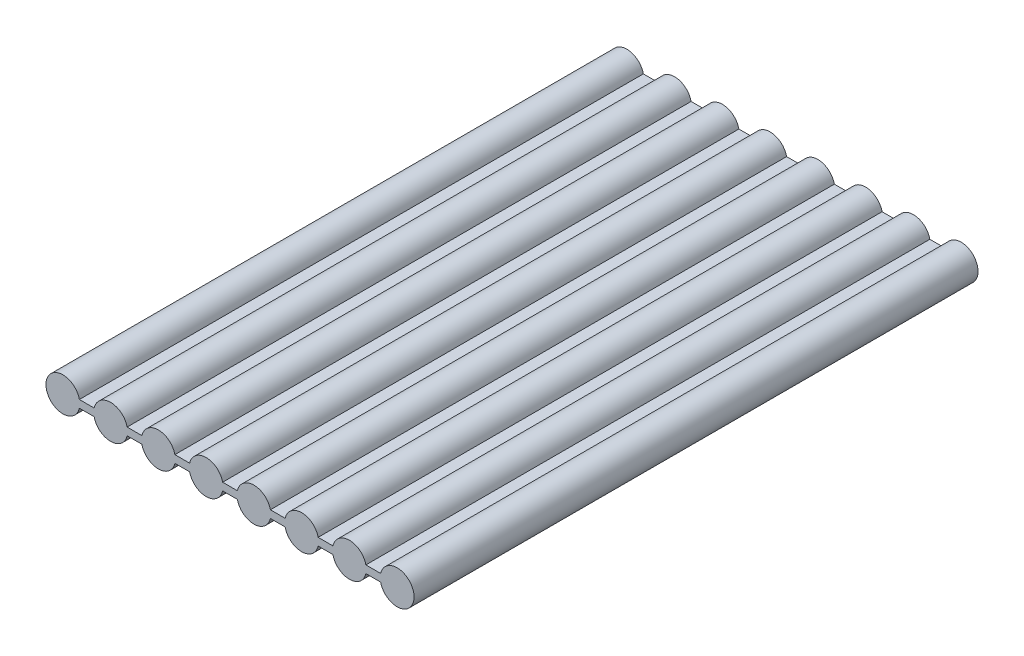
ISO-10303-21;
HEADER;
FILE_DESCRIPTION(('STEP AP214'),'2;1');
FILE_NAME('part.step','',(''),(''),'','','');
FILE_SCHEMA(('AUTOMOTIVE_DESIGN { 1 0 10303 214 1 1 1 1 }'));
ENDSEC;
DATA;
#1=APPLICATION_CONTEXT('core data for automotive mechanical design processes');
#2=APPLICATION_PROTOCOL_DEFINITION('international standard','automotive_design',2000,#1);
#3=PRODUCT_CONTEXT('',#1,'mechanical');
#4=PRODUCT('Part','Part','',(#3));
#5=PRODUCT_RELATED_PRODUCT_CATEGORY('part','',(#4));
#6=PRODUCT_DEFINITION_FORMATION('','',#4);
#7=PRODUCT_DEFINITION_CONTEXT('part definition',#1,'design');
#8=PRODUCT_DEFINITION('design','',#6,#7);
#9=PRODUCT_DEFINITION_SHAPE('','',#8);
#10=(LENGTH_UNIT() NAMED_UNIT(*) SI_UNIT(.MILLI.,.METRE.));
#11=(NAMED_UNIT(*) PLANE_ANGLE_UNIT() SI_UNIT($,.RADIAN.));
#12=(NAMED_UNIT(*) SI_UNIT($,.STERADIAN.) SOLID_ANGLE_UNIT());
#13=UNCERTAINTY_MEASURE_WITH_UNIT(LENGTH_MEASURE(1.E-05),#10,'distance_accuracy_value','');
#14=(GEOMETRIC_REPRESENTATION_CONTEXT(3) GLOBAL_UNCERTAINTY_ASSIGNED_CONTEXT((#13)) GLOBAL_UNIT_ASSIGNED_CONTEXT((#10,
#11,#12)) REPRESENTATION_CONTEXT('',''));
#15=CARTESIAN_POINT('',(0.,0.,0.));
#16=DIRECTION('',(0.,0.,1.));
#17=DIRECTION('',(1.,0.,0.));
#18=AXIS2_PLACEMENT_3D('',#15,#16,#17);
#19=CARTESIAN_POINT('',(3.175,0.,7.5));
#20=DIRECTION('',(0.,0.,-1.));
#21=DIRECTION('',(-1.,0.,0.));
#22=AXIS2_PLACEMENT_3D('',#19,#20,#21);
#23=CYLINDRICAL_SURFACE('',#22,0.45);
#24=DIRECTION('',(0.,0.,-1.));
#25=VECTOR('',#24,1.);
#26=CARTESIAN_POINT('',(3.61374821936961,-0.1,7.5));
#27=LINE('',#26,#25);
#28=CARTESIAN_POINT('',(3.61374821936961,-0.1,7.5));
#29=VERTEX_POINT('',#28);
#30=CARTESIAN_POINT('',(3.61374821936961,-0.1,-7.5));
#31=VERTEX_POINT('',#30);
#32=EDGE_CURVE('E231',#29,#31,#27,.T.);
#33=ORIENTED_EDGE('',*,*,#32,.F.);
#34=CARTESIAN_POINT('',(3.175,0.,7.5));
#35=DIRECTION('',(0.,0.,1.));
#36=DIRECTION('',(1.,0.,0.));
#37=AXIS2_PLACEMENT_3D('',#34,#35,#36);
#38=CIRCLE('',#37,0.45);
#39=CARTESIAN_POINT('',(2.73625178063039,-0.1,7.5));
#40=VERTEX_POINT('',#39);
#41=EDGE_CURVE('E256',#40,#29,#38,.T.);
#42=ORIENTED_EDGE('',*,*,#41,.F.);
#43=DIRECTION('',(0.,0.,-1.));
#44=VECTOR('',#43,1.);
#45=CARTESIAN_POINT('',(2.73625178063039,-0.0999999999999999,7.5));
#46=LINE('',#45,#44);
#47=CARTESIAN_POINT('',(2.73625178063039,-0.1,-7.5));
#48=VERTEX_POINT('',#47);
#49=EDGE_CURVE('E278',#40,#48,#46,.T.);
#50=ORIENTED_EDGE('',*,*,#49,.T.);
#51=CARTESIAN_POINT('',(3.175,0.,-7.5));
#52=DIRECTION('',(0.,0.,1.));
#53=DIRECTION('',(1.,0.,0.));
#54=AXIS2_PLACEMENT_3D('',#51,#52,#53);
#55=CIRCLE('',#54,0.45);
#56=EDGE_CURVE('E50',#48,#31,#55,.T.);
#57=ORIENTED_EDGE('',*,*,#56,.T.);
#58=EDGE_LOOP('',(#33,#42,#50,#57));
#59=FACE_BOUND('',#58,.T.);
#60=ADVANCED_FACE('F34',(#59),#23,.T.);
#61=DIRECTION('',(0.,0.,-1.));
#62=VECTOR('',#61,1.);
#63=CARTESIAN_POINT('',(3.61374821936961,0.1,7.5));
#64=LINE('',#63,#62);
#65=CARTESIAN_POINT('',(3.61374821936961,0.1,7.5));
#66=VERTEX_POINT('',#65);
#67=CARTESIAN_POINT('',(3.61374821936961,0.1,-7.5));
#68=VERTEX_POINT('',#67);
#69=EDGE_CURVE('E251',#66,#68,#64,.T.);
#70=ORIENTED_EDGE('',*,*,#69,.T.);
#71=CARTESIAN_POINT('',(2.73625178063039,0.1,-7.5));
#72=VERTEX_POINT('',#71);
#73=EDGE_CURVE('E255',#68,#72,#55,.T.);
#74=ORIENTED_EDGE('',*,*,#73,.T.);
#75=DIRECTION('',(0.,0.,-1.));
#76=VECTOR('',#75,1.);
#77=CARTESIAN_POINT('',(2.73625178063039,0.1,7.5));
#78=LINE('',#77,#76);
#79=CARTESIAN_POINT('',(2.73625178063039,0.1,7.5));
#80=VERTEX_POINT('',#79);
#81=EDGE_CURVE('E275',#80,#72,#78,.T.);
#82=ORIENTED_EDGE('',*,*,#81,.F.);
#83=EDGE_CURVE('E58',#66,#80,#38,.T.);
#84=ORIENTED_EDGE('',*,*,#83,.F.);
#85=EDGE_LOOP('',(#70,#74,#82,#84));
#86=FACE_BOUND('',#85,.T.);
#87=ADVANCED_FACE('F499',(#86),#23,.T.);
#88=CARTESIAN_POINT('',(1.905,0.,7.5));
#89=DIRECTION('',(0.,0.,-1.));
#90=DIRECTION('',(-1.,0.,0.));
#91=AXIS2_PLACEMENT_3D('',#88,#89,#90);
#92=CYLINDRICAL_SURFACE('',#91,0.45);
#93=DIRECTION('',(0.,0.,-1.));
#94=VECTOR('',#93,1.);
#95=CARTESIAN_POINT('',(2.34374821936961,-0.1,7.5));
#96=LINE('',#95,#94);
#97=CARTESIAN_POINT('',(2.34374821936961,-0.1,7.5));
#98=VERTEX_POINT('',#97);
#99=CARTESIAN_POINT('',(2.34374821936961,-0.1,-7.5));
#100=VERTEX_POINT('',#99);
#101=EDGE_CURVE('E280',#98,#100,#96,.T.);
#102=ORIENTED_EDGE('',*,*,#101,.F.);
#103=CARTESIAN_POINT('',(1.905,0.,7.5));
#104=DIRECTION('',(0.,0.,1.));
#105=DIRECTION('',(1.,0.,0.));
#106=AXIS2_PLACEMENT_3D('',#103,#104,#105);
#107=CIRCLE('',#106,0.45);
#108=CARTESIAN_POINT('',(1.46625178063039,-0.1,7.5));
#109=VERTEX_POINT('',#108);
#110=EDGE_CURVE('E284',#109,#98,#107,.T.);
#111=ORIENTED_EDGE('',*,*,#110,.F.);
#112=DIRECTION('',(0.,0.,-1.));
#113=VECTOR('',#112,1.);
#114=CARTESIAN_POINT('',(1.46625178063039,-0.0999999999999999,7.5));
#115=LINE('',#114,#113);
#116=CARTESIAN_POINT('',(1.46625178063039,-0.1,-7.5));
#117=VERTEX_POINT('',#116);
#118=EDGE_CURVE('E308',#109,#117,#115,.T.);
#119=ORIENTED_EDGE('',*,*,#118,.T.);
#120=CARTESIAN_POINT('',(1.905,0.,-7.5));
#121=DIRECTION('',(0.,0.,1.));
#122=DIRECTION('',(1.,0.,0.));
#123=AXIS2_PLACEMENT_3D('',#120,#121,#122);
#124=CIRCLE('',#123,0.45);
#125=EDGE_CURVE('E289',#117,#100,#124,.T.);
#126=ORIENTED_EDGE('',*,*,#125,.T.);
#127=EDGE_LOOP('',(#102,#111,#119,#126));
#128=FACE_BOUND('',#127,.T.);
#129=ADVANCED_FACE('F496',(#128),#92,.T.);
#130=DIRECTION('',(0.,0.,-1.));
#131=VECTOR('',#130,1.);
#132=CARTESIAN_POINT('',(2.34374821936961,0.1,7.5));
#133=LINE('',#132,#131);
#134=CARTESIAN_POINT('',(2.34374821936961,0.1,7.5));
#135=VERTEX_POINT('',#134);
#136=CARTESIAN_POINT('',(2.34374821936961,0.1,-7.5));
#137=VERTEX_POINT('',#136);
#138=EDGE_CURVE('E268',#135,#137,#133,.T.);
#139=ORIENTED_EDGE('',*,*,#138,.T.);
#140=CARTESIAN_POINT('',(1.46625178063039,0.1,-7.5));
#141=VERTEX_POINT('',#140);
#142=EDGE_CURVE('E283',#137,#141,#124,.T.);
#143=ORIENTED_EDGE('',*,*,#142,.T.);
#144=DIRECTION('',(0.,0.,-1.));
#145=VECTOR('',#144,1.);
#146=CARTESIAN_POINT('',(1.46625178063039,0.1,7.5));
#147=LINE('',#146,#145);
#148=CARTESIAN_POINT('',(1.46625178063039,0.1,7.5));
#149=VERTEX_POINT('',#148);
#150=EDGE_CURVE('E305',#149,#141,#147,.T.);
#151=ORIENTED_EDGE('',*,*,#150,.F.);
#152=EDGE_CURVE('E288',#135,#149,#107,.T.);
#153=ORIENTED_EDGE('',*,*,#152,.F.);
#154=EDGE_LOOP('',(#139,#143,#151,#153));
#155=FACE_BOUND('',#154,.T.);
#156=ADVANCED_FACE('F498',(#155),#92,.T.);
#157=CARTESIAN_POINT('',(0.635,0.,7.5));
#158=DIRECTION('',(0.,0.,-1.));
#159=DIRECTION('',(-1.,0.,0.));
#160=AXIS2_PLACEMENT_3D('',#157,#158,#159);
#161=CYLINDRICAL_SURFACE('',#160,0.45);
#162=DIRECTION('',(0.,0.,-1.));
#163=VECTOR('',#162,1.);
#164=CARTESIAN_POINT('',(1.07374821936961,-0.1,7.5));
#165=LINE('',#164,#163);
#166=CARTESIAN_POINT('',(1.07374821936961,-0.1,7.5));
#167=VERTEX_POINT('',#166);
#168=CARTESIAN_POINT('',(1.07374821936961,-0.1,-7.5));
#169=VERTEX_POINT('',#168);
#170=EDGE_CURVE('E310',#167,#169,#165,.T.);
#171=ORIENTED_EDGE('',*,*,#170,.F.);
#172=CARTESIAN_POINT('',(0.635,0.,7.5));
#173=DIRECTION('',(0.,0.,1.));
#174=DIRECTION('',(1.,0.,0.));
#175=AXIS2_PLACEMENT_3D('',#172,#173,#174);
#176=CIRCLE('',#175,0.45);
#177=CARTESIAN_POINT('',(0.196251780630394,-0.1,7.5));
#178=VERTEX_POINT('',#177);
#179=EDGE_CURVE('E314',#178,#167,#176,.T.);
#180=ORIENTED_EDGE('',*,*,#179,.F.);
#181=DIRECTION('',(0.,0.,-1.));
#182=VECTOR('',#181,1.);
#183=CARTESIAN_POINT('',(0.196251780630394,-0.0999999999999999,7.5));
#184=LINE('',#183,#182);
#185=CARTESIAN_POINT('',(0.196251780630394,-0.1,-7.5));
#186=VERTEX_POINT('',#185);
#187=EDGE_CURVE('E338',#178,#186,#184,.T.);
#188=ORIENTED_EDGE('',*,*,#187,.T.);
#189=CARTESIAN_POINT('',(0.635,0.,-7.5));
#190=DIRECTION('',(0.,0.,1.));
#191=DIRECTION('',(1.,0.,0.));
#192=AXIS2_PLACEMENT_3D('',#189,#190,#191);
#193=CIRCLE('',#192,0.45);
#194=EDGE_CURVE('E319',#186,#169,#193,.T.);
#195=ORIENTED_EDGE('',*,*,#194,.T.);
#196=EDGE_LOOP('',(#171,#180,#188,#195));
#197=FACE_BOUND('',#196,.T.);
#198=ADVANCED_FACE('F485',(#197),#161,.T.);
#199=DIRECTION('',(0.,0.,-1.));
#200=VECTOR('',#199,1.);
#201=CARTESIAN_POINT('',(1.07374821936961,0.1,7.5));
#202=LINE('',#201,#200);
#203=CARTESIAN_POINT('',(1.07374821936961,0.1,7.5));
#204=VERTEX_POINT('',#203);
#205=CARTESIAN_POINT('',(1.07374821936961,0.1,-7.5));
#206=VERTEX_POINT('',#205);
#207=EDGE_CURVE('E298',#204,#206,#202,.T.);
#208=ORIENTED_EDGE('',*,*,#207,.T.);
#209=CARTESIAN_POINT('',(0.196251780630394,0.1,-7.5));
#210=VERTEX_POINT('',#209);
#211=EDGE_CURVE('E313',#206,#210,#193,.T.);
#212=ORIENTED_EDGE('',*,*,#211,.T.);
#213=DIRECTION('',(0.,0.,-1.));
#214=VECTOR('',#213,1.);
#215=CARTESIAN_POINT('',(0.196251780630394,0.1,7.5));
#216=LINE('',#215,#214);
#217=CARTESIAN_POINT('',(0.196251780630394,0.1,7.5));
#218=VERTEX_POINT('',#217);
#219=EDGE_CURVE('E335',#218,#210,#216,.T.);
#220=ORIENTED_EDGE('',*,*,#219,.F.);
#221=EDGE_CURVE('E318',#204,#218,#176,.T.);
#222=ORIENTED_EDGE('',*,*,#221,.F.);
#223=EDGE_LOOP('',(#208,#212,#220,#222));
#224=FACE_BOUND('',#223,.T.);
#225=ADVANCED_FACE('F532',(#224),#161,.T.);
#226=CARTESIAN_POINT('',(-0.635,0.,7.5));
#227=DIRECTION('',(0.,0.,-1.));
#228=DIRECTION('',(-1.,0.,0.));
#229=AXIS2_PLACEMENT_3D('',#226,#227,#228);
#230=CYLINDRICAL_SURFACE('',#229,0.45);
#231=DIRECTION('',(0.,0.,-1.));
#232=VECTOR('',#231,1.);
#233=CARTESIAN_POINT('',(-0.196251780630394,-0.1,7.5));
#234=LINE('',#233,#232);
#235=CARTESIAN_POINT('',(-0.196251780630394,-0.1,7.5));
#236=VERTEX_POINT('',#235);
#237=CARTESIAN_POINT('',(-0.196251780630394,-0.1,-7.5));
#238=VERTEX_POINT('',#237);
#239=EDGE_CURVE('E340',#236,#238,#234,.T.);
#240=ORIENTED_EDGE('',*,*,#239,.F.);
#241=CARTESIAN_POINT('',(-0.635,0.,7.5));
#242=DIRECTION('',(0.,0.,1.));
#243=DIRECTION('',(1.,0.,0.));
#244=AXIS2_PLACEMENT_3D('',#241,#242,#243);
#245=CIRCLE('',#244,0.45);
#246=CARTESIAN_POINT('',(-1.07374821936961,-0.1,7.5));
#247=VERTEX_POINT('',#246);
#248=EDGE_CURVE('E344',#247,#236,#245,.T.);
#249=ORIENTED_EDGE('',*,*,#248,.F.);
#250=DIRECTION('',(0.,0.,-1.));
#251=VECTOR('',#250,1.);
#252=CARTESIAN_POINT('',(-1.07374821936961,-0.0999999999999999,7.5));
#253=LINE('',#252,#251);
#254=CARTESIAN_POINT('',(-1.07374821936961,-0.1,-7.5));
#255=VERTEX_POINT('',#254);
#256=EDGE_CURVE('E368',#247,#255,#253,.T.);
#257=ORIENTED_EDGE('',*,*,#256,.T.);
#258=CARTESIAN_POINT('',(-0.635,0.,-7.5));
#259=DIRECTION('',(0.,0.,1.));
#260=DIRECTION('',(1.,0.,0.));
#261=AXIS2_PLACEMENT_3D('',#258,#259,#260);
#262=CIRCLE('',#261,0.45);
#263=EDGE_CURVE('E349',#255,#238,#262,.T.);
#264=ORIENTED_EDGE('',*,*,#263,.T.);
#265=EDGE_LOOP('',(#240,#249,#257,#264));
#266=FACE_BOUND('',#265,.T.);
#267=ADVANCED_FACE('F475',(#266),#230,.T.);
#268=DIRECTION('',(0.,0.,-1.));
#269=VECTOR('',#268,1.);
#270=CARTESIAN_POINT('',(-0.196251780630394,0.1,7.5));
#271=LINE('',#270,#269);
#272=CARTESIAN_POINT('',(-0.196251780630394,0.1,7.5));
#273=VERTEX_POINT('',#272);
#274=CARTESIAN_POINT('',(-0.196251780630394,0.1,-7.5));
#275=VERTEX_POINT('',#274);
#276=EDGE_CURVE('E328',#273,#275,#271,.T.);
#277=ORIENTED_EDGE('',*,*,#276,.T.);
#278=CARTESIAN_POINT('',(-1.07374821936961,0.1,-7.5));
#279=VERTEX_POINT('',#278);
#280=EDGE_CURVE('E343',#275,#279,#262,.T.);
#281=ORIENTED_EDGE('',*,*,#280,.T.);
#282=DIRECTION('',(0.,0.,-1.));
#283=VECTOR('',#282,1.);
#284=CARTESIAN_POINT('',(-1.07374821936961,0.1,7.5));
#285=LINE('',#284,#283);
#286=CARTESIAN_POINT('',(-1.07374821936961,0.1,7.5));
#287=VERTEX_POINT('',#286);
#288=EDGE_CURVE('E365',#287,#279,#285,.T.);
#289=ORIENTED_EDGE('',*,*,#288,.F.);
#290=EDGE_CURVE('E348',#273,#287,#245,.T.);
#291=ORIENTED_EDGE('',*,*,#290,.F.);
#292=EDGE_LOOP('',(#277,#281,#289,#291));
#293=FACE_BOUND('',#292,.T.);
#294=ADVANCED_FACE('F541',(#293),#230,.T.);
#295=CARTESIAN_POINT('',(-1.905,0.,7.5));
#296=DIRECTION('',(0.,0.,-1.));
#297=DIRECTION('',(-1.,0.,0.));
#298=AXIS2_PLACEMENT_3D('',#295,#296,#297);
#299=CYLINDRICAL_SURFACE('',#298,0.45);
#300=DIRECTION('',(0.,0.,-1.));
#301=VECTOR('',#300,1.);
#302=CARTESIAN_POINT('',(-1.46625178063039,-0.1,7.5));
#303=LINE('',#302,#301);
#304=CARTESIAN_POINT('',(-1.46625178063039,-0.1,7.5));
#305=VERTEX_POINT('',#304);
#306=CARTESIAN_POINT('',(-1.46625178063039,-0.1,-7.5));
#307=VERTEX_POINT('',#306);
#308=EDGE_CURVE('E370',#305,#307,#303,.T.);
#309=ORIENTED_EDGE('',*,*,#308,.F.);
#310=CARTESIAN_POINT('',(-1.905,0.,7.5));
#311=DIRECTION('',(0.,0.,1.));
#312=DIRECTION('',(1.,0.,0.));
#313=AXIS2_PLACEMENT_3D('',#310,#311,#312);
#314=CIRCLE('',#313,0.45);
#315=CARTESIAN_POINT('',(-2.34374821936961,-0.1,7.5));
#316=VERTEX_POINT('',#315);
#317=EDGE_CURVE('E11',#316,#305,#314,.T.);
#318=ORIENTED_EDGE('',*,*,#317,.F.);
#319=DIRECTION('',(0.,0.,-1.));
#320=VECTOR('',#319,1.);
#321=CARTESIAN_POINT('',(-2.34374821936961,-0.0999999999999999,7.5));
#322=LINE('',#321,#320);
#323=CARTESIAN_POINT('',(-2.34374821936961,-0.0999999999999999,-7.5));
#324=VERTEX_POINT('',#323);
#325=EDGE_CURVE('E425',#316,#324,#322,.T.);
#326=ORIENTED_EDGE('',*,*,#325,.T.);
#327=CARTESIAN_POINT('',(-1.905,0.,-7.5));
#328=DIRECTION('',(0.,0.,1.));
#329=DIRECTION('',(1.,0.,0.));
#330=AXIS2_PLACEMENT_3D('',#327,#328,#329);
#331=CIRCLE('',#330,0.45);
#332=EDGE_CURVE('E38',#324,#307,#331,.T.);
#333=ORIENTED_EDGE('',*,*,#332,.T.);
#334=EDGE_LOOP('',(#309,#318,#326,#333));
#335=FACE_BOUND('',#334,.T.);
#336=ADVANCED_FACE('F36',(#335),#299,.T.);
#337=DIRECTION('',(0.,0.,-1.));
#338=VECTOR('',#337,1.);
#339=CARTESIAN_POINT('',(-1.46625178063039,0.1,7.5));
#340=LINE('',#339,#338);
#341=CARTESIAN_POINT('',(-1.46625178063039,0.1,7.5));
#342=VERTEX_POINT('',#341);
#343=CARTESIAN_POINT('',(-1.46625178063039,0.1,-7.5));
#344=VERTEX_POINT('',#343);
#345=EDGE_CURVE('E358',#342,#344,#340,.T.);
#346=ORIENTED_EDGE('',*,*,#345,.T.);
#347=CARTESIAN_POINT('',(-2.34374821936961,0.1,-7.5));
#348=VERTEX_POINT('',#347);
#349=EDGE_CURVE('E430',#344,#348,#331,.T.);
#350=ORIENTED_EDGE('',*,*,#349,.T.);
#351=DIRECTION('',(0.,0.,-1.));
#352=VECTOR('',#351,1.);
#353=CARTESIAN_POINT('',(-2.34374821936961,0.1,7.5));
#354=LINE('',#353,#352);
#355=CARTESIAN_POINT('',(-2.34374821936961,0.1,7.5));
#356=VERTEX_POINT('',#355);
#357=EDGE_CURVE('E422',#356,#348,#354,.T.);
#358=ORIENTED_EDGE('',*,*,#357,.F.);
#359=EDGE_CURVE('E43',#342,#356,#314,.T.);
#360=ORIENTED_EDGE('',*,*,#359,.F.);
#361=EDGE_LOOP('',(#346,#350,#358,#360));
#362=FACE_BOUND('',#361,.T.);
#363=ADVANCED_FACE('F443',(#362),#299,.T.);
#364=CARTESIAN_POINT('',(-1.905,0.,7.5));
#365=DIRECTION('',(0.,0.,1.));
#366=DIRECTION('',(1.,0.,0.));
#367=AXIS2_PLACEMENT_3D('',#364,#365,#366);
#368=PLANE('',#367);
#369=ORIENTED_EDGE('',*,*,#317,.T.);
#370=DIRECTION('',(1.,0.,0.));
#371=VECTOR('',#370,1.);
#372=CARTESIAN_POINT('',(-1.46625178063039,-0.1,7.5));
#373=LINE('',#372,#371);
#374=EDGE_CURVE('E351',#305,#247,#373,.T.);
#375=ORIENTED_EDGE('',*,*,#374,.T.);
#376=ORIENTED_EDGE('',*,*,#248,.T.);
#377=DIRECTION('',(1.,0.,0.));
#378=VECTOR('',#377,1.);
#379=CARTESIAN_POINT('',(-0.196251780630394,-0.1,7.5));
#380=LINE('',#379,#378);
#381=EDGE_CURVE('E321',#236,#178,#380,.T.);
#382=ORIENTED_EDGE('',*,*,#381,.T.);
#383=ORIENTED_EDGE('',*,*,#179,.T.);
#384=DIRECTION('',(1.,0.,0.));
#385=VECTOR('',#384,1.);
#386=CARTESIAN_POINT('',(1.07374821936961,-0.1,7.5));
#387=LINE('',#386,#385);
#388=EDGE_CURVE('E291',#167,#109,#387,.T.);
#389=ORIENTED_EDGE('',*,*,#388,.T.);
#390=ORIENTED_EDGE('',*,*,#110,.T.);
#391=DIRECTION('',(1.,0.,0.));
#392=VECTOR('',#391,1.);
#393=CARTESIAN_POINT('',(2.34374821936961,-0.1,7.5));
#394=LINE('',#393,#392);
#395=EDGE_CURVE('E261',#98,#40,#394,.T.);
#396=ORIENTED_EDGE('',*,*,#395,.T.);
#397=ORIENTED_EDGE('',*,*,#41,.T.);
#398=DIRECTION('',(1.,0.,0.));
#399=VECTOR('',#398,1.);
#400=CARTESIAN_POINT('',(3.61374821936961,-0.1,7.5));
#401=LINE('',#400,#399);
#402=CARTESIAN_POINT('',(4.00625178063039,-0.1,7.5));
#403=VERTEX_POINT('',#402);
#404=EDGE_CURVE('E244',#29,#403,#401,.T.);
#405=ORIENTED_EDGE('',*,*,#404,.T.);
#406=CARTESIAN_POINT('',(4.445,0.,7.5));
#407=DIRECTION('',(0.,0.,1.));
#408=DIRECTION('',(1.,0.,0.));
#409=AXIS2_PLACEMENT_3D('',#406,#407,#408);
#410=CIRCLE('',#409,0.45);
#411=CARTESIAN_POINT('',(4.00625178063039,0.1,7.5));
#412=VERTEX_POINT('',#411);
#413=EDGE_CURVE('E226',#403,#412,#410,.T.);
#414=ORIENTED_EDGE('',*,*,#413,.T.);
#415=DIRECTION('',(-1.,0.,0.));
#416=VECTOR('',#415,1.);
#417=CARTESIAN_POINT('',(3.61374821936961,0.1,7.5));
#418=LINE('',#417,#416);
#419=EDGE_CURVE('E248',#412,#66,#418,.T.);
#420=ORIENTED_EDGE('',*,*,#419,.T.);
#421=ORIENTED_EDGE('',*,*,#83,.T.);
#422=DIRECTION('',(-1.,0.,0.));
#423=VECTOR('',#422,1.);
#424=CARTESIAN_POINT('',(2.34374821936961,0.1,7.5));
#425=LINE('',#424,#423);
#426=EDGE_CURVE('E264',#80,#135,#425,.T.);
#427=ORIENTED_EDGE('',*,*,#426,.T.);
#428=ORIENTED_EDGE('',*,*,#152,.T.);
#429=DIRECTION('',(-1.,0.,0.));
#430=VECTOR('',#429,1.);
#431=CARTESIAN_POINT('',(1.07374821936961,0.1,7.5));
#432=LINE('',#431,#430);
#433=EDGE_CURVE('E294',#149,#204,#432,.T.);
#434=ORIENTED_EDGE('',*,*,#433,.T.);
#435=ORIENTED_EDGE('',*,*,#221,.T.);
#436=DIRECTION('',(-1.,0.,0.));
#437=VECTOR('',#436,1.);
#438=CARTESIAN_POINT('',(-0.196251780630394,0.1,7.5));
#439=LINE('',#438,#437);
#440=EDGE_CURVE('E324',#218,#273,#439,.T.);
#441=ORIENTED_EDGE('',*,*,#440,.T.);
#442=ORIENTED_EDGE('',*,*,#290,.T.);
#443=DIRECTION('',(-1.,0.,0.));
#444=VECTOR('',#443,1.);
#445=CARTESIAN_POINT('',(-1.46625178063039,0.1,7.5));
#446=LINE('',#445,#444);
#447=EDGE_CURVE('E354',#287,#342,#446,.T.);
#448=ORIENTED_EDGE('',*,*,#447,.T.);
#449=ORIENTED_EDGE('',*,*,#359,.T.);
#450=DIRECTION('',(-1.,0.,0.));
#451=VECTOR('',#450,1.);
#452=CARTESIAN_POINT('',(-2.73625178063039,0.1,7.5));
#453=LINE('',#452,#451);
#454=CARTESIAN_POINT('',(-2.73625178063039,0.1,7.5));
#455=VERTEX_POINT('',#454);
#456=EDGE_CURVE('E413',#356,#455,#453,.T.);
#457=ORIENTED_EDGE('',*,*,#456,.T.);
#458=CARTESIAN_POINT('',(-3.175,0.,7.5));
#459=DIRECTION('',(0.,0.,1.));
#460=DIRECTION('',(1.,0.,0.));
#461=AXIS2_PLACEMENT_3D('',#458,#459,#460);
#462=CIRCLE('',#461,0.45);
#463=CARTESIAN_POINT('',(-3.61374821936961,0.1,7.5));
#464=VERTEX_POINT('',#463);
#465=EDGE_CURVE('E378',#455,#464,#462,.T.);
#466=ORIENTED_EDGE('',*,*,#465,.T.);
#467=DIRECTION('',(-1.,0.,0.));
#468=VECTOR('',#467,1.);
#469=CARTESIAN_POINT('',(-4.00625178063039,0.1,7.5));
#470=LINE('',#469,#468);
#471=CARTESIAN_POINT('',(-4.00625178063039,0.1,7.5));
#472=VERTEX_POINT('',#471);
#473=EDGE_CURVE('E385',#464,#472,#470,.T.);
#474=ORIENTED_EDGE('',*,*,#473,.T.);
#475=CARTESIAN_POINT('',(-4.445,0.,7.5));
#476=DIRECTION('',(0.,0.,1.));
#477=DIRECTION('',(1.,0.,0.));
#478=AXIS2_PLACEMENT_3D('',#475,#476,#477);
#479=CIRCLE('',#478,0.45);
#480=CARTESIAN_POINT('',(-4.00625178063039,-0.1,7.5));
#481=VERTEX_POINT('',#480);
#482=EDGE_CURVE('E405',#472,#481,#479,.T.);
#483=ORIENTED_EDGE('',*,*,#482,.T.);
#484=DIRECTION('',(1.,0.,0.));
#485=VECTOR('',#484,1.);
#486=CARTESIAN_POINT('',(-4.00625178063039,-0.1,7.5));
#487=LINE('',#486,#485);
#488=CARTESIAN_POINT('',(-3.61374821936961,-0.1,7.5));
#489=VERTEX_POINT('',#488);
#490=EDGE_CURVE('E382',#481,#489,#487,.T.);
#491=ORIENTED_EDGE('',*,*,#490,.T.);
#492=CARTESIAN_POINT('',(-2.73625178063039,-0.1,7.5));
#493=VERTEX_POINT('',#492);
#494=EDGE_CURVE('E374',#489,#493,#462,.T.);
#495=ORIENTED_EDGE('',*,*,#494,.T.);
#496=DIRECTION('',(1.,0.,0.));
#497=VECTOR('',#496,1.);
#498=CARTESIAN_POINT('',(-2.73625178063039,-0.1,7.5));
#499=LINE('',#498,#497);
#500=EDGE_CURVE('E410',#493,#316,#499,.T.);
#501=ORIENTED_EDGE('',*,*,#500,.T.);
#502=EDGE_LOOP('',(#369,#375,#376,#382,#383,#389,#390,#396,#397,#405,#414,#420,#421,#427,#428,
#434,#435,#441,#442,#448,#449,#457,#466,#474,#483,#491,#495,#501));
#503=FACE_BOUND('',#502,.T.);
#504=ADVANCED_FACE('F438',(#503),#368,.T.);
#505=CARTESIAN_POINT('',(-1.905,0.,-7.5));
#506=DIRECTION('',(0.,0.,1.));
#507=DIRECTION('',(1.,0.,0.));
#508=AXIS2_PLACEMENT_3D('',#505,#506,#507);
#509=PLANE('',#508);
#510=ORIENTED_EDGE('',*,*,#332,.F.);
#511=DIRECTION('',(1.,0.,0.));
#512=VECTOR('',#511,1.);
#513=CARTESIAN_POINT('',(-2.73625178063039,-0.1,-7.5));
#514=LINE('',#513,#512);
#515=CARTESIAN_POINT('',(-2.73625178063039,-0.1,-7.5));
#516=VERTEX_POINT('',#515);
#517=EDGE_CURVE('E408',#516,#324,#514,.T.);
#518=ORIENTED_EDGE('',*,*,#517,.F.);
#519=CARTESIAN_POINT('',(-3.175,0.,-7.5));
#520=DIRECTION('',(0.,0.,1.));
#521=DIRECTION('',(1.,0.,0.));
#522=AXIS2_PLACEMENT_3D('',#519,#520,#521);
#523=CIRCLE('',#522,0.45);
#524=CARTESIAN_POINT('',(-3.61374821936961,-0.1,-7.5));
#525=VERTEX_POINT('',#524);
#526=EDGE_CURVE('E379',#525,#516,#523,.T.);
#527=ORIENTED_EDGE('',*,*,#526,.F.);
#528=DIRECTION('',(1.,0.,0.));
#529=VECTOR('',#528,1.);
#530=CARTESIAN_POINT('',(-4.00625178063039,-0.1,-7.5));
#531=LINE('',#530,#529);
#532=CARTESIAN_POINT('',(-4.00625178063039,-0.1,-7.5));
#533=VERTEX_POINT('',#532);
#534=EDGE_CURVE('E377',#533,#525,#531,.T.);
#535=ORIENTED_EDGE('',*,*,#534,.F.);
#536=CARTESIAN_POINT('',(-4.445,0.,-7.5));
#537=DIRECTION('',(0.,0.,1.));
#538=DIRECTION('',(1.,0.,0.));
#539=AXIS2_PLACEMENT_3D('',#536,#537,#538);
#540=CIRCLE('',#539,0.45);
#541=CARTESIAN_POINT('',(-4.00625178063039,0.1,-7.5));
#542=VERTEX_POINT('',#541);
#543=EDGE_CURVE('E404',#542,#533,#540,.T.);
#544=ORIENTED_EDGE('',*,*,#543,.F.);
#545=DIRECTION('',(-1.,0.,0.));
#546=VECTOR('',#545,1.);
#547=CARTESIAN_POINT('',(-4.00625178063039,0.1,-7.5));
#548=LINE('',#547,#546);
#549=CARTESIAN_POINT('',(-3.61374821936961,0.1,-7.5));
#550=VERTEX_POINT('',#549);
#551=EDGE_CURVE('E386',#550,#542,#548,.T.);
#552=ORIENTED_EDGE('',*,*,#551,.F.);
#553=CARTESIAN_POINT('',(-2.73625178063039,0.1,-7.5));
#554=VERTEX_POINT('',#553);
#555=EDGE_CURVE('E373',#554,#550,#523,.T.);
#556=ORIENTED_EDGE('',*,*,#555,.F.);
#557=DIRECTION('',(-1.,0.,0.));
#558=VECTOR('',#557,1.);
#559=CARTESIAN_POINT('',(-2.73625178063039,0.1,-7.5));
#560=LINE('',#559,#558);
#561=EDGE_CURVE('E414',#348,#554,#560,.T.);
#562=ORIENTED_EDGE('',*,*,#561,.F.);
#563=ORIENTED_EDGE('',*,*,#349,.F.);
#564=DIRECTION('',(-1.,0.,0.));
#565=VECTOR('',#564,1.);
#566=CARTESIAN_POINT('',(-1.46625178063039,0.1,-7.5));
#567=LINE('',#566,#565);
#568=EDGE_CURVE('E355',#279,#344,#567,.T.);
#569=ORIENTED_EDGE('',*,*,#568,.F.);
#570=ORIENTED_EDGE('',*,*,#280,.F.);
#571=DIRECTION('',(-1.,0.,0.));
#572=VECTOR('',#571,1.);
#573=CARTESIAN_POINT('',(-0.196251780630394,0.1,-7.5));
#574=LINE('',#573,#572);
#575=EDGE_CURVE('E325',#210,#275,#574,.T.);
#576=ORIENTED_EDGE('',*,*,#575,.F.);
#577=ORIENTED_EDGE('',*,*,#211,.F.);
#578=DIRECTION('',(-1.,0.,0.));
#579=VECTOR('',#578,1.);
#580=CARTESIAN_POINT('',(1.07374821936961,0.1,-7.5));
#581=LINE('',#580,#579);
#582=EDGE_CURVE('E295',#141,#206,#581,.T.);
#583=ORIENTED_EDGE('',*,*,#582,.F.);
#584=ORIENTED_EDGE('',*,*,#142,.F.);
#585=DIRECTION('',(-1.,0.,0.));
#586=VECTOR('',#585,1.);
#587=CARTESIAN_POINT('',(2.34374821936961,0.1,-7.5));
#588=LINE('',#587,#586);
#589=EDGE_CURVE('E265',#72,#137,#588,.T.);
#590=ORIENTED_EDGE('',*,*,#589,.F.);
#591=ORIENTED_EDGE('',*,*,#73,.F.);
#592=DIRECTION('',(-1.,0.,0.));
#593=VECTOR('',#592,1.);
#594=CARTESIAN_POINT('',(3.61374821936961,0.1,-7.5));
#595=LINE('',#594,#593);
#596=CARTESIAN_POINT('',(4.00625178063039,0.1,-7.5));
#597=VERTEX_POINT('',#596);
#598=EDGE_CURVE('E240',#597,#68,#595,.T.);
#599=ORIENTED_EDGE('',*,*,#598,.F.);
#600=CARTESIAN_POINT('',(4.445,0.,-7.5));
#601=DIRECTION('',(0.,0.,1.));
#602=DIRECTION('',(1.,0.,0.));
#603=AXIS2_PLACEMENT_3D('',#600,#601,#602);
#604=CIRCLE('',#603,0.45);
#605=CARTESIAN_POINT('',(4.00625178063039,-0.1,-7.5));
#606=VERTEX_POINT('',#605);
#607=EDGE_CURVE('E223',#606,#597,#604,.T.);
#608=ORIENTED_EDGE('',*,*,#607,.F.);
#609=DIRECTION('',(1.,0.,0.));
#610=VECTOR('',#609,1.);
#611=CARTESIAN_POINT('',(3.61374821936961,-0.1,-7.5));
#612=LINE('',#611,#610);
#613=EDGE_CURVE('E237',#31,#606,#612,.T.);
#614=ORIENTED_EDGE('',*,*,#613,.F.);
#615=ORIENTED_EDGE('',*,*,#56,.F.);
#616=DIRECTION('',(1.,0.,0.));
#617=VECTOR('',#616,1.);
#618=CARTESIAN_POINT('',(2.34374821936961,-0.1,-7.5));
#619=LINE('',#618,#617);
#620=EDGE_CURVE('E259',#100,#48,#619,.T.);
#621=ORIENTED_EDGE('',*,*,#620,.F.);
#622=ORIENTED_EDGE('',*,*,#125,.F.);
#623=DIRECTION('',(1.,0.,0.));
#624=VECTOR('',#623,1.);
#625=CARTESIAN_POINT('',(1.07374821936961,-0.1,-7.5));
#626=LINE('',#625,#624);
#627=EDGE_CURVE('E287',#169,#117,#626,.T.);
#628=ORIENTED_EDGE('',*,*,#627,.F.);
#629=ORIENTED_EDGE('',*,*,#194,.F.);
#630=DIRECTION('',(1.,0.,0.));
#631=VECTOR('',#630,1.);
#632=CARTESIAN_POINT('',(-0.196251780630394,-0.1,-7.5));
#633=LINE('',#632,#631);
#634=EDGE_CURVE('E317',#238,#186,#633,.T.);
#635=ORIENTED_EDGE('',*,*,#634,.F.);
#636=ORIENTED_EDGE('',*,*,#263,.F.);
#637=DIRECTION('',(1.,0.,0.));
#638=VECTOR('',#637,1.);
#639=CARTESIAN_POINT('',(-1.46625178063039,-0.1,-7.5));
#640=LINE('',#639,#638);
#641=EDGE_CURVE('E347',#307,#255,#640,.T.);
#642=ORIENTED_EDGE('',*,*,#641,.F.);
#643=EDGE_LOOP('',(#510,#518,#527,#535,#544,#552,#556,#562,#563,#569,#570,#576,#577,#583,#584,
#590,#591,#599,#608,#614,#615,#621,#622,#628,#629,#635,#636,#642));
#644=FACE_BOUND('',#643,.T.);
#645=ADVANCED_FACE('F236',(#644),#509,.F.);
#646=CARTESIAN_POINT('',(-2.73625178063039,-0.1,7.5));
#647=DIRECTION('',(0.,1.,0.));
#648=DIRECTION('',(0.,0.,1.));
#649=AXIS2_PLACEMENT_3D('',#646,#647,#648);
#650=PLANE('',#649);
#651=ORIENTED_EDGE('',*,*,#517,.T.);
#652=ORIENTED_EDGE('',*,*,#325,.F.);
#653=ORIENTED_EDGE('',*,*,#500,.F.);
#654=DIRECTION('',(0.,0.,-1.));
#655=VECTOR('',#654,1.);
#656=CARTESIAN_POINT('',(-2.73625178063039,-0.1,7.5));
#657=LINE('',#656,#655);
#658=EDGE_CURVE('E428',#493,#516,#657,.T.);
#659=ORIENTED_EDGE('',*,*,#658,.T.);
#660=EDGE_LOOP('',(#651,#652,#653,#659));
#661=FACE_BOUND('',#660,.T.);
#662=ADVANCED_FACE('F468',(#661),#650,.F.);
#663=CARTESIAN_POINT('',(-2.73625178063039,0.1,7.5));
#664=DIRECTION('',(0.,-1.,0.));
#665=DIRECTION('',(0.,0.,-1.));
#666=AXIS2_PLACEMENT_3D('',#663,#664,#665);
#667=PLANE('',#666);
#668=ORIENTED_EDGE('',*,*,#561,.T.);
#669=DIRECTION('',(0.,0.,-1.));
#670=VECTOR('',#669,1.);
#671=CARTESIAN_POINT('',(-2.73625178063039,0.1,7.5));
#672=LINE('',#671,#670);
#673=EDGE_CURVE('E416',#455,#554,#672,.T.);
#674=ORIENTED_EDGE('',*,*,#673,.F.);
#675=ORIENTED_EDGE('',*,*,#456,.F.);
#676=ORIENTED_EDGE('',*,*,#357,.T.);
#677=EDGE_LOOP('',(#668,#674,#675,#676));
#678=FACE_BOUND('',#677,.T.);
#679=ADVANCED_FACE('F446',(#678),#667,.F.);
#680=CARTESIAN_POINT('',(-3.175,0.,7.5));
#681=DIRECTION('',(0.,0.,-1.));
#682=DIRECTION('',(-1.,0.,0.));
#683=AXIS2_PLACEMENT_3D('',#680,#681,#682);
#684=CYLINDRICAL_SURFACE('',#683,0.45);
#685=ORIENTED_EDGE('',*,*,#526,.T.);
#686=ORIENTED_EDGE('',*,*,#658,.F.);
#687=ORIENTED_EDGE('',*,*,#494,.F.);
#688=DIRECTION('',(0.,0.,-1.));
#689=VECTOR('',#688,1.);
#690=CARTESIAN_POINT('',(-3.61374821936961,-0.0999999999999999,7.5));
#691=LINE('',#690,#689);
#692=EDGE_CURVE('E399',#489,#525,#691,.T.);
#693=ORIENTED_EDGE('',*,*,#692,.T.);
#694=EDGE_LOOP('',(#685,#686,#687,#693));
#695=FACE_BOUND('',#694,.T.);
#696=ADVANCED_FACE('F466',(#695),#684,.T.);
#697=ORIENTED_EDGE('',*,*,#465,.F.);
#698=ORIENTED_EDGE('',*,*,#673,.T.);
#699=ORIENTED_EDGE('',*,*,#555,.T.);
#700=DIRECTION('',(0.,0.,-1.));
#701=VECTOR('',#700,1.);
#702=CARTESIAN_POINT('',(-3.61374821936961,0.1,7.5));
#703=LINE('',#702,#701);
#704=EDGE_CURVE('E396',#464,#550,#703,.T.);
#705=ORIENTED_EDGE('',*,*,#704,.F.);
#706=EDGE_LOOP('',(#697,#698,#699,#705));
#707=FACE_BOUND('',#706,.T.);
#708=ADVANCED_FACE('F451',(#707),#684,.T.);
#709=CARTESIAN_POINT('',(-4.445,0.,7.5));
#710=DIRECTION('',(0.,0.,-1.));
#711=DIRECTION('',(-1.,0.,0.));
#712=AXIS2_PLACEMENT_3D('',#709,#710,#711);
#713=CYLINDRICAL_SURFACE('',#712,0.45);
#714=DIRECTION('',(0.,0.,-1.));
#715=VECTOR('',#714,1.);
#716=CARTESIAN_POINT('',(-4.00625178063039,-0.1,7.5));
#717=LINE('',#716,#715);
#718=EDGE_CURVE('E401',#481,#533,#717,.T.);
#719=ORIENTED_EDGE('',*,*,#718,.F.);
#720=ORIENTED_EDGE('',*,*,#482,.F.);
#721=DIRECTION('',(0.,0.,-1.));
#722=VECTOR('',#721,1.);
#723=CARTESIAN_POINT('',(-4.00625178063039,0.1,7.5));
#724=LINE('',#723,#722);
#725=EDGE_CURVE('E389',#472,#542,#724,.T.);
#726=ORIENTED_EDGE('',*,*,#725,.T.);
#727=ORIENTED_EDGE('',*,*,#543,.T.);
#728=EDGE_LOOP('',(#719,#720,#726,#727));
#729=FACE_BOUND('',#728,.T.);
#730=ADVANCED_FACE('F459',(#729),#713,.T.);
#731=CARTESIAN_POINT('',(-4.00625178063039,-0.1,7.5));
#732=DIRECTION('',(0.,1.,0.));
#733=DIRECTION('',(0.,0.,1.));
#734=AXIS2_PLACEMENT_3D('',#731,#732,#733);
#735=PLANE('',#734);
#736=ORIENTED_EDGE('',*,*,#534,.T.);
#737=ORIENTED_EDGE('',*,*,#692,.F.);
#738=ORIENTED_EDGE('',*,*,#490,.F.);
#739=ORIENTED_EDGE('',*,*,#718,.T.);
#740=EDGE_LOOP('',(#736,#737,#738,#739));
#741=FACE_BOUND('',#740,.T.);
#742=ADVANCED_FACE('F462',(#741),#735,.F.);
#743=CARTESIAN_POINT('',(-4.00625178063039,0.1,7.5));
#744=DIRECTION('',(0.,-1.,0.));
#745=DIRECTION('',(0.,0.,-1.));
#746=AXIS2_PLACEMENT_3D('',#743,#744,#745);
#747=PLANE('',#746);
#748=ORIENTED_EDGE('',*,*,#551,.T.);
#749=ORIENTED_EDGE('',*,*,#725,.F.);
#750=ORIENTED_EDGE('',*,*,#473,.F.);
#751=ORIENTED_EDGE('',*,*,#704,.T.);
#752=EDGE_LOOP('',(#748,#749,#750,#751));
#753=FACE_BOUND('',#752,.T.);
#754=ADVANCED_FACE('F456',(#753),#747,.F.);
#755=CARTESIAN_POINT('',(-1.46625178063039,-0.1,7.5));
#756=DIRECTION('',(0.,1.,0.));
#757=DIRECTION('',(0.,0.,1.));
#758=AXIS2_PLACEMENT_3D('',#755,#756,#757);
#759=PLANE('',#758);
#760=ORIENTED_EDGE('',*,*,#641,.T.);
#761=ORIENTED_EDGE('',*,*,#256,.F.);
#762=ORIENTED_EDGE('',*,*,#374,.F.);
#763=ORIENTED_EDGE('',*,*,#308,.T.);
#764=EDGE_LOOP('',(#760,#761,#762,#763));
#765=FACE_BOUND('',#764,.T.);
#766=ADVANCED_FACE('F472',(#765),#759,.F.);
#767=CARTESIAN_POINT('',(-1.46625178063039,0.1,7.5));
#768=DIRECTION('',(0.,-1.,0.));
#769=DIRECTION('',(0.,0.,-1.));
#770=AXIS2_PLACEMENT_3D('',#767,#768,#769);
#771=PLANE('',#770);
#772=ORIENTED_EDGE('',*,*,#568,.T.);
#773=ORIENTED_EDGE('',*,*,#345,.F.);
#774=ORIENTED_EDGE('',*,*,#447,.F.);
#775=ORIENTED_EDGE('',*,*,#288,.T.);
#776=EDGE_LOOP('',(#772,#773,#774,#775));
#777=FACE_BOUND('',#776,.T.);
#778=ADVANCED_FACE('F538',(#777),#771,.F.);
#779=CARTESIAN_POINT('',(-0.196251780630394,-0.1,7.5));
#780=DIRECTION('',(0.,1.,0.));
#781=DIRECTION('',(0.,0.,1.));
#782=AXIS2_PLACEMENT_3D('',#779,#780,#781);
#783=PLANE('',#782);
#784=ORIENTED_EDGE('',*,*,#634,.T.);
#785=ORIENTED_EDGE('',*,*,#187,.F.);
#786=ORIENTED_EDGE('',*,*,#381,.F.);
#787=ORIENTED_EDGE('',*,*,#239,.T.);
#788=EDGE_LOOP('',(#784,#785,#786,#787));
#789=FACE_BOUND('',#788,.T.);
#790=ADVANCED_FACE('F482',(#789),#783,.F.);
#791=CARTESIAN_POINT('',(-0.196251780630394,0.1,7.5));
#792=DIRECTION('',(0.,-1.,0.));
#793=DIRECTION('',(0.,0.,-1.));
#794=AXIS2_PLACEMENT_3D('',#791,#792,#793);
#795=PLANE('',#794);
#796=ORIENTED_EDGE('',*,*,#575,.T.);
#797=ORIENTED_EDGE('',*,*,#276,.F.);
#798=ORIENTED_EDGE('',*,*,#440,.F.);
#799=ORIENTED_EDGE('',*,*,#219,.T.);
#800=EDGE_LOOP('',(#796,#797,#798,#799));
#801=FACE_BOUND('',#800,.T.);
#802=ADVANCED_FACE('F527',(#801),#795,.F.);
#803=CARTESIAN_POINT('',(1.07374821936961,-0.1,7.5));
#804=DIRECTION('',(0.,1.,0.));
#805=DIRECTION('',(0.,0.,1.));
#806=AXIS2_PLACEMENT_3D('',#803,#804,#805);
#807=PLANE('',#806);
#808=ORIENTED_EDGE('',*,*,#627,.T.);
#809=ORIENTED_EDGE('',*,*,#118,.F.);
#810=ORIENTED_EDGE('',*,*,#388,.F.);
#811=ORIENTED_EDGE('',*,*,#170,.T.);
#812=EDGE_LOOP('',(#808,#809,#810,#811));
#813=FACE_BOUND('',#812,.T.);
#814=ADVANCED_FACE('F487',(#813),#807,.F.);
#815=CARTESIAN_POINT('',(1.07374821936961,0.1,7.5));
#816=DIRECTION('',(0.,-1.,0.));
#817=DIRECTION('',(0.,0.,-1.));
#818=AXIS2_PLACEMENT_3D('',#815,#816,#817);
#819=PLANE('',#818);
#820=ORIENTED_EDGE('',*,*,#582,.T.);
#821=ORIENTED_EDGE('',*,*,#207,.F.);
#822=ORIENTED_EDGE('',*,*,#433,.F.);
#823=ORIENTED_EDGE('',*,*,#150,.T.);
#824=EDGE_LOOP('',(#820,#821,#822,#823));
#825=FACE_BOUND('',#824,.T.);
#826=ADVANCED_FACE('F519',(#825),#819,.F.);
#827=CARTESIAN_POINT('',(2.34374821936961,-0.1,7.5));
#828=DIRECTION('',(0.,1.,0.));
#829=DIRECTION('',(0.,0.,1.));
#830=AXIS2_PLACEMENT_3D('',#827,#828,#829);
#831=PLANE('',#830);
#832=ORIENTED_EDGE('',*,*,#620,.T.);
#833=ORIENTED_EDGE('',*,*,#49,.F.);
#834=ORIENTED_EDGE('',*,*,#395,.F.);
#835=ORIENTED_EDGE('',*,*,#101,.T.);
#836=EDGE_LOOP('',(#832,#833,#834,#835));
#837=FACE_BOUND('',#836,.T.);
#838=ADVANCED_FACE('F493',(#837),#831,.F.);
#839=CARTESIAN_POINT('',(2.34374821936961,0.1,7.5));
#840=DIRECTION('',(0.,-1.,0.));
#841=DIRECTION('',(0.,0.,-1.));
#842=AXIS2_PLACEMENT_3D('',#839,#840,#841);
#843=PLANE('',#842);
#844=ORIENTED_EDGE('',*,*,#589,.T.);
#845=ORIENTED_EDGE('',*,*,#138,.F.);
#846=ORIENTED_EDGE('',*,*,#426,.F.);
#847=ORIENTED_EDGE('',*,*,#81,.T.);
#848=EDGE_LOOP('',(#844,#845,#846,#847));
#849=FACE_BOUND('',#848,.T.);
#850=ADVANCED_FACE('F515',(#849),#843,.F.);
#851=CARTESIAN_POINT('',(3.61374821936961,-0.1,7.5));
#852=DIRECTION('',(0.,1.,0.));
#853=DIRECTION('',(0.,0.,1.));
#854=AXIS2_PLACEMENT_3D('',#851,#852,#853);
#855=PLANE('',#854);
#856=ORIENTED_EDGE('',*,*,#613,.T.);
#857=DIRECTION('',(0.,0.,-1.));
#858=VECTOR('',#857,1.);
#859=CARTESIAN_POINT('',(4.00625178063039,-0.0999999999999999,7.5));
#860=LINE('',#859,#858);
#861=EDGE_CURVE('E220',#403,#606,#860,.T.);
#862=ORIENTED_EDGE('',*,*,#861,.F.);
#863=ORIENTED_EDGE('',*,*,#404,.F.);
#864=ORIENTED_EDGE('',*,*,#32,.T.);
#865=EDGE_LOOP('',(#856,#862,#863,#864));
#866=FACE_BOUND('',#865,.T.);
#867=ADVANCED_FACE('F242',(#866),#855,.F.);
#868=CARTESIAN_POINT('',(3.61374821936961,0.1,7.5));
#869=DIRECTION('',(0.,-1.,0.));
#870=DIRECTION('',(0.,0.,-1.));
#871=AXIS2_PLACEMENT_3D('',#868,#869,#870);
#872=PLANE('',#871);
#873=ORIENTED_EDGE('',*,*,#598,.T.);
#874=ORIENTED_EDGE('',*,*,#69,.F.);
#875=ORIENTED_EDGE('',*,*,#419,.F.);
#876=DIRECTION('',(0.,0.,-1.));
#877=VECTOR('',#876,1.);
#878=CARTESIAN_POINT('',(4.00625178063039,0.1,7.5));
#879=LINE('',#878,#877);
#880=EDGE_CURVE('E232',#412,#597,#879,.T.);
#881=ORIENTED_EDGE('',*,*,#880,.T.);
#882=EDGE_LOOP('',(#873,#874,#875,#881));
#883=FACE_BOUND('',#882,.T.);
#884=ADVANCED_FACE('F641',(#883),#872,.F.);
#885=CARTESIAN_POINT('',(4.445,0.,7.5));
#886=DIRECTION('',(0.,0.,-1.));
#887=DIRECTION('',(-1.,0.,0.));
#888=AXIS2_PLACEMENT_3D('',#885,#886,#887);
#889=CYLINDRICAL_SURFACE('',#888,0.45);
#890=ORIENTED_EDGE('',*,*,#413,.F.);
#891=ORIENTED_EDGE('',*,*,#861,.T.);
#892=ORIENTED_EDGE('',*,*,#607,.T.);
#893=ORIENTED_EDGE('',*,*,#880,.F.);
#894=EDGE_LOOP('',(#890,#891,#892,#893));
#895=FACE_BOUND('',#894,.T.);
#896=ADVANCED_FACE('F222',(#895),#889,.T.);
#897=CLOSED_SHELL('',(#60,#87,#129,#156,#198,#225,#267,#294,#336,#363,#504,#645,#662,#679,#696,
#708,#730,#742,#754,#766,#778,#790,#802,#814,#826,#838,#850,#867,#884,#896));
#898=MANIFOLD_SOLID_BREP('B2',#897);
#899=ADVANCED_BREP_SHAPE_REPRESENTATION('',(#18,#898),#14);
#900=SHAPE_DEFINITION_REPRESENTATION(#9,#899);
ENDSEC;
END-ISO-10303-21;
